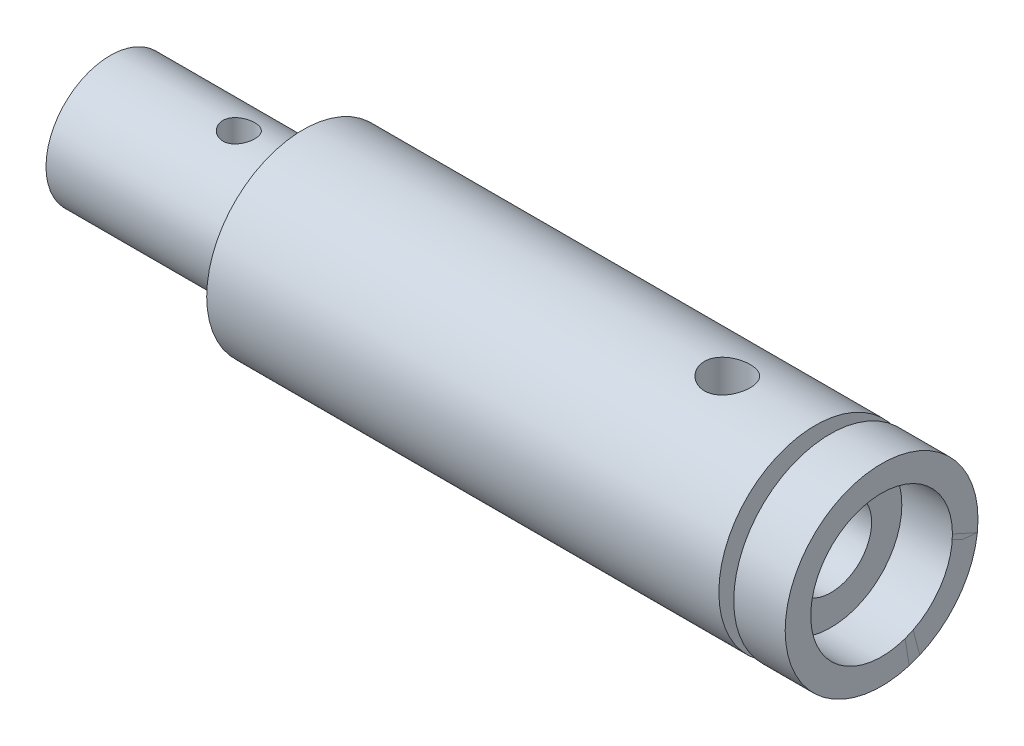
ISO-10303-21;
HEADER;
FILE_DESCRIPTION(('STEP AP214'),'2;1');
FILE_NAME('part.step','',(''),(''),'','','');
FILE_SCHEMA(('AUTOMOTIVE_DESIGN { 1 0 10303 214 1 1 1 1 }'));
ENDSEC;
DATA;
#1=APPLICATION_CONTEXT('core data for automotive mechanical design processes');
#2=APPLICATION_PROTOCOL_DEFINITION('international standard','automotive_design',2000,#1);
#3=PRODUCT_CONTEXT('',#1,'mechanical');
#4=PRODUCT('Part','Part','',(#3));
#5=PRODUCT_RELATED_PRODUCT_CATEGORY('part','',(#4));
#6=PRODUCT_DEFINITION_FORMATION('','',#4);
#7=PRODUCT_DEFINITION_CONTEXT('part definition',#1,'design');
#8=PRODUCT_DEFINITION('design','',#6,#7);
#9=PRODUCT_DEFINITION_SHAPE('','',#8);
#10=(LENGTH_UNIT() NAMED_UNIT(*) SI_UNIT(.MILLI.,.METRE.));
#11=(NAMED_UNIT(*) PLANE_ANGLE_UNIT() SI_UNIT($,.RADIAN.));
#12=(NAMED_UNIT(*) SI_UNIT($,.STERADIAN.) SOLID_ANGLE_UNIT());
#13=UNCERTAINTY_MEASURE_WITH_UNIT(LENGTH_MEASURE(1.E-05),#10,'distance_accuracy_value','');
#14=(GEOMETRIC_REPRESENTATION_CONTEXT(3) GLOBAL_UNCERTAINTY_ASSIGNED_CONTEXT((#13)) GLOBAL_UNIT_ASSIGNED_CONTEXT((#10,
#11,#12)) REPRESENTATION_CONTEXT('',''));
#15=CARTESIAN_POINT('',(0.,0.,0.));
#16=DIRECTION('',(0.,0.,1.));
#17=DIRECTION('',(1.,0.,0.));
#18=AXIS2_PLACEMENT_3D('',#15,#16,#17);
#19=CARTESIAN_POINT('',(38.1,0.,0.));
#20=DIRECTION('',(1.,0.,0.));
#21=DIRECTION('',(0.,0.,-1.));
#22=AXIS2_PLACEMENT_3D('',#19,#20,#21);
#23=PLANE('',#22);
#24=CARTESIAN_POINT('',(38.1,0.,0.));
#25=DIRECTION('',(1.,0.,0.));
#26=DIRECTION('',(0.,0.,-1.));
#27=AXIS2_PLACEMENT_3D('',#24,#25,#26);
#28=CIRCLE('',#27,3.5000057);
#29=CARTESIAN_POINT('',(38.1,0.,-3.5000057));
#30=VERTEX_POINT('',#29);
#31=EDGE_CURVE('E51',#30,#30,#28,.T.);
#32=ORIENTED_EDGE('',*,*,#31,.F.);
#33=EDGE_LOOP('',(#32));
#34=FACE_BOUND('',#33,.T.);
#35=CARTESIAN_POINT('',(38.1,0.,0.));
#36=DIRECTION('',(1.,0.,0.));
#37=DIRECTION('',(0.,0.,-1.));
#38=AXIS2_PLACEMENT_3D('',#35,#36,#37);
#39=CIRCLE('',#38,4.7625);
#40=CARTESIAN_POINT('',(38.1,0.,-4.7625));
#41=VERTEX_POINT('',#40);
#42=EDGE_CURVE('E11',#41,#41,#39,.T.);
#43=ORIENTED_EDGE('',*,*,#42,.T.);
#44=EDGE_LOOP('',(#43));
#45=FACE_BOUND('',#44,.T.);
#46=ADVANCED_FACE('F47',(#34,#45),#23,.T.);
#47=OPEN_SHELL('',(#46));
#48=SHELL_BASED_SURFACE_MODEL('B2',(#47));
#49=CARTESIAN_POINT('',(38.1,0.,0.));
#50=DIRECTION('',(-1.,0.,0.));
#51=DIRECTION('',(0.,0.,1.));
#52=AXIS2_PLACEMENT_3D('',#49,#50,#51);
#53=CYLINDRICAL_SURFACE('',#52,4.7625);
#54=CARTESIAN_POINT('',(30.48,4.62642714845916,-1.13030000000001));
#55=CARTESIAN_POINT('',(30.4174775259716,4.62642838901824,-1.13029805423628));
#56=CARTESIAN_POINT('',(30.3549327757224,4.62770838699482,-1.12509469807993));
#57=CARTESIAN_POINT('',(30.231632022083,4.6326785638604,-1.10444752292998));
#58=CARTESIAN_POINT('',(30.1708771909426,4.63637028710392,-1.08899714213106));
#59=CARTESIAN_POINT('',(30.0529575827576,4.64572278948456,-1.04837814678198));
#60=CARTESIAN_POINT('',(29.9957885619544,4.65138118712487,-1.02322128202527));
#61=CARTESIAN_POINT('',(29.8864782330937,4.66402656033618,-0.963938374115178));
#62=CARTESIAN_POINT('',(29.8343370072882,4.67101355763678,-0.929812184262627));
#63=CARTESIAN_POINT('',(29.7355270444801,4.68568402813969,-0.852836301919562));
#64=CARTESIAN_POINT('',(29.6889727707916,4.69337771733691,-0.809841598425515));
#65=CARTESIAN_POINT('',(29.6036641255741,4.70850573012954,-0.716661805014789));
#66=CARTESIAN_POINT('',(29.5649104296223,4.71594003121431,-0.666476092957034));
#67=CARTESIAN_POINT('',(29.4958411997972,4.72982392662853,-0.559561665599796));
#68=CARTESIAN_POINT('',(29.4656371319024,4.7362600587655,-0.50275904156));
#69=CARTESIAN_POINT('',(29.4152477682259,4.74730637166582,-0.384705189759934));
#70=CARTESIAN_POINT('',(29.3950611441609,4.75191679449644,-0.323454553028317));
#71=CARTESIAN_POINT('',(29.3656435558391,4.75872001042334,-0.199435431201457));
#72=CARTESIAN_POINT('',(29.3562184738088,4.76095558789368,-0.136715378385376));
#73=CARTESIAN_POINT('',(29.3479831971712,4.76290595779978,-0.0105471731538505));
#74=CARTESIAN_POINT('',(29.3491715822857,4.7626210875181,0.0529008807067508));
#75=CARTESIAN_POINT('',(29.3619878043426,4.75959486535025,0.177381143927697));
#76=CARTESIAN_POINT('',(29.3734062398402,4.75690278929689,0.23843628935024));
#77=CARTESIAN_POINT('',(29.4060230697014,4.74942148334886,0.357738034135681));
#78=CARTESIAN_POINT('',(29.427221954153,4.74463214836336,0.41598449259665));
#79=CARTESIAN_POINT('',(29.4789739129789,4.73341744305927,0.528579543133836));
#80=CARTESIAN_POINT('',(29.5096035332136,4.72697876022153,0.582891572165093));
#81=CARTESIAN_POINT('',(29.5792898743976,4.7131670289965,0.685679466576262));
#82=CARTESIAN_POINT('',(29.6183479300973,4.70579383269348,0.734154405681971));
#83=CARTESIAN_POINT('',(29.7049124952201,4.69070701664461,0.825139727879797));
#84=CARTESIAN_POINT('',(29.7526021517143,4.68298948105039,0.867475386599062));
#85=CARTESIAN_POINT('',(29.854484880592,4.66825033727962,0.943584762001427));
#86=CARTESIAN_POINT('',(29.9086781985238,4.66122875539735,0.97735815526305));
#87=CARTESIAN_POINT('',(30.0223470965797,4.64866391717303,1.03548149898306));
#88=CARTESIAN_POINT('',(30.0818429361595,4.64312668568723,1.05979322029419));
#89=CARTESIAN_POINT('',(30.2042394839337,4.6342370321862,1.09801758146265));
#90=CARTESIAN_POINT('',(30.2671395417684,4.63088419443757,1.11193220016863));
#91=CARTESIAN_POINT('',(30.3929486305075,4.62682920681551,1.12868548039285));
#92=CARTESIAN_POINT('',(30.4558215409437,4.62606563978159,1.13178082925176));
#93=CARTESIAN_POINT('',(30.5811852257098,4.62710909642491,1.12750718204535));
#94=CARTESIAN_POINT('',(30.6436760309748,4.6289159091626,1.12013904467148));
#95=CARTESIAN_POINT('',(30.7655736827724,4.63483804338209,1.09537169422542));
#96=CARTESIAN_POINT('',(30.8250119865441,4.63891973604529,1.07811850697576));
#97=CARTESIAN_POINT('',(30.9401535080337,4.64890046664806,1.03423110579621));
#98=CARTESIAN_POINT('',(30.9958563170258,4.6547997030637,1.0075958672993));
#99=CARTESIAN_POINT('',(31.1030430296264,4.66788249324333,0.945151389946631));
#100=CARTESIAN_POINT('',(31.1544337592089,4.67508711291606,0.909186724966106));
#101=CARTESIAN_POINT('',(31.2505449640821,4.68991561801779,0.829303668896753));
#102=CARTESIAN_POINT('',(31.2952644544695,4.69753956512693,0.785384105507542));
#103=CARTESIAN_POINT('',(31.3777852160885,4.71255346581324,0.689666770395243));
#104=CARTESIAN_POINT('',(31.4154099797708,4.7199344104917,0.637715160229861));
#105=CARTESIAN_POINT('',(31.481399685825,4.73345357065448,0.528080996625007));
#106=CARTESIAN_POINT('',(31.5097650949585,4.73959184877535,0.470398732257507));
#107=CARTESIAN_POINT('',(31.5561977943514,4.74989666973638,0.351326818689582));
#108=CARTESIAN_POINT('',(31.5743360521981,4.75407676549875,0.289966071089918));
#109=CARTESIAN_POINT('',(31.6000166732252,4.76005328584338,0.164956304659746));
#110=CARTESIAN_POINT('',(31.6075608670675,4.76185012225163,0.101307683125541));
#111=CARTESIAN_POINT('',(31.6117448257628,4.76284277619185,-0.0248058123466602));
#112=CARTESIAN_POINT('',(31.6086463021068,4.76210102100744,-0.0872616512535999));
#113=CARTESIAN_POINT('',(31.5922263168143,4.75823630150041,-0.210735438966013));
#114=CARTESIAN_POINT('',(31.5789051060361,4.75511339560976,-0.271753423017674));
#115=CARTESIAN_POINT('',(31.5425522659879,4.74684485428859,-0.390375307573608));
#116=CARTESIAN_POINT('',(31.5195637211855,4.74170820034098,-0.447993078219313));
#117=CARTESIAN_POINT('',(31.4645687352297,4.72995611183917,-0.558585363410872));
#118=CARTESIAN_POINT('',(31.4325612606168,4.72334050783327,-0.611559344922472));
#119=CARTESIAN_POINT('',(31.3596156117081,4.70916627810365,-0.712616660322828));
#120=CARTESIAN_POINT('',(31.3184970787535,4.70159016205745,-0.760567360093442));
#121=CARTESIAN_POINT('',(31.2288524871105,4.68643366014744,-0.848977207813524));
#122=CARTESIAN_POINT('',(31.180324596891,4.67885327369088,-0.889434497967525));
#123=CARTESIAN_POINT('',(31.0762828135499,4.66440648065221,-0.962354542237788));
#124=CARTESIAN_POINT('',(31.0206675833458,4.65755378982526,-0.994675617729678));
#125=CARTESIAN_POINT('',(30.904640168282,4.64551729998629,-1.04946070676234));
#126=CARTESIAN_POINT('',(30.8442317610909,4.64033220265826,-1.07193239358026));
#127=CARTESIAN_POINT('',(30.7332121579242,4.63309160945185,-1.10275167928249));
#128=CARTESIAN_POINT('',(30.6831641625617,4.63061028274686,-1.11306095578954));
#129=CARTESIAN_POINT('',(30.5820823499598,4.62727760135537,-1.1268356772371));
#130=CARTESIAN_POINT('',(30.5310486001582,4.62642613556252,-1.13030158868497));
#131=CARTESIAN_POINT('',(30.48,4.62642714845916,-1.13030000000001));
#132=B_SPLINE_CURVE_WITH_KNOTS('',3,(#54,#55,#56,#57,#58,#59,#60,#61,#62,#63,#64,#65,#66,#67,
#68,#69,#70,#71,#72,#73,#74,#75,#76,#77,#78,#79,#80,#81,#82,#83,#84,#85,#86,#87,#88,#89,#90,#91,
#92,#93,#94,#95,#96,#97,#98,#99,#100,#101,#102,#103,#104,#105,#106,#107,#108,#109,#110,#111,
#112,#113,#114,#115,#116,#117,#118,#119,#120,#121,#122,#123,#124,#125,#126,#127,#128,#129,#130,
#131),.UNSPECIFIED.,.T.,.F.,(4,2,2,2,2,2,2,2,2,2,2,2,2,2,2,2,2,2,2,2,2,2,2,2,2,2,2,2,2,2,2,2,2,
2,2,2,2,2,4),(0.,0.187380121042666,0.374880349201827,0.562154315010251,0.749431343997337,
0.940055506735493,1.13069617158295,1.32371850082296,1.51671522902966,1.70617275891674,
1.89560493626408,2.08124599438501,2.26689635579563,2.45409517358993,2.64132365848949,
2.83312791507996,3.02493941559167,3.21751806320305,3.41006004856846,3.59800175755486,
3.78592804389816,3.97114726568218,4.15638672060753,4.34493623230586,4.53351355287895,
4.72629599338792,4.91906871428539,5.11048675596528,5.30187171639604,5.48858443275627,
5.67529256744964,5.86117727273008,6.04708328680093,6.23706378966135,6.42709133036922,
6.62022893778871,6.81321581056899,6.96621911322522,7.11921198539395),.UNSPECIFIED.);
#133=CARTESIAN_POINT('',(30.48,4.62642714845916,-1.13030000000001));
#134=VERTEX_POINT('',#133);
#135=EDGE_CURVE('E86',#134,#134,#132,.T.);
#136=ORIENTED_EDGE('',*,*,#135,.F.);
#137=EDGE_LOOP('',(#136));
#138=FACE_BOUND('',#137,.T.);
#139=CARTESIAN_POINT('',(9.525,0.,0.));
#140=DIRECTION('',(-1.,0.,0.));
#141=DIRECTION('',(0.,0.,1.));
#142=AXIS2_PLACEMENT_3D('',#139,#140,#141);
#143=CIRCLE('',#142,4.7625);
#144=CARTESIAN_POINT('',(9.525,0.,4.7625));
#145=VERTEX_POINT('',#144);
#146=EDGE_CURVE('E98',#145,#145,#143,.T.);
#147=ORIENTED_EDGE('',*,*,#146,.F.);
#148=EDGE_LOOP('',(#147));
#149=FACE_BOUND('',#148,.T.);
#150=CARTESIAN_POINT('',(34.8234,0.,0.));
#151=DIRECTION('',(1.,0.,0.));
#152=DIRECTION('',(0.,0.,-1.));
#153=AXIS2_PLACEMENT_3D('',#150,#151,#152);
#154=CIRCLE('',#153,4.7625);
#155=CARTESIAN_POINT('',(34.8234,0.,-4.7625));
#156=VERTEX_POINT('',#155);
#157=EDGE_CURVE('E129',#156,#156,#154,.T.);
#158=ORIENTED_EDGE('',*,*,#157,.F.);
#159=EDGE_LOOP('',(#158));
#160=FACE_BOUND('',#159,.T.);
#161=ADVANCED_FACE('F72',(#138,#149,#160),#53,.T.);
#162=CARTESIAN_POINT('',(27.686,0.,0.));
#163=DIRECTION('',(1.,0.,0.));
#164=DIRECTION('',(0.,0.,-1.));
#165=AXIS2_PLACEMENT_3D('',#162,#163,#164);
#166=CYLINDRICAL_SURFACE('',#165,2.0066);
#167=CARTESIAN_POINT('',(30.48,1.65797028622348,-1.13030000000001));
#168=CARTESIAN_POINT('',(30.537651209096,1.65797637198511,-1.13029575818968));
#169=CARTESIAN_POINT('',(30.5953460500531,1.6610253484613,-1.12585828294536));
#170=CARTESIAN_POINT('',(30.7088640189629,1.67273264944485,-1.10838248876552));
#171=CARTESIAN_POINT('',(30.7646840246714,1.68139988609383,-1.09533050419437));
#172=CARTESIAN_POINT('',(30.872577119279,1.70299732881238,-1.06143323018494));
#173=CARTESIAN_POINT('',(30.9246720396219,1.7158996982644,-1.04063871395274));
#174=CARTESIAN_POINT('',(31.0246106018923,1.74446762861599,-0.992002970624401));
#175=CARTESIAN_POINT('',(31.0724532218785,1.76013385105756,-0.964160055763447));
#176=CARTESIAN_POINT('',(31.1681287413124,1.79448726439517,-0.898756055590563));
#177=CARTESIAN_POINT('',(31.215418621699,1.81331851857658,-0.860476031372304));
#178=CARTESIAN_POINT('',(31.303346743248,1.85072451409441,-0.776766436810115));
#179=CARTESIAN_POINT('',(31.343980781707,1.86929908662915,-0.731332384427765));
#180=CARTESIAN_POINT('',(31.421103338456,1.90611899100281,-0.629554883377021));
#181=CARTESIAN_POINT('',(31.4568739746953,1.92417921142352,-0.572593976802603));
#182=CARTESIAN_POINT('',(31.518070785692,1.95595793429568,-0.452252347783174));
#183=CARTESIAN_POINT('',(31.5435052285507,1.96967990502991,-0.388876807408988));
#184=CARTESIAN_POINT('',(31.5809841456561,1.99017791322298,-0.263298922756156));
#185=CARTESIAN_POINT('',(31.5939958143849,1.99745173094696,-0.201468493186618));
#186=CARTESIAN_POINT('',(31.6094970835921,2.00613694274782,-0.0761139088710515));
#187=CARTESIAN_POINT('',(31.6119951448153,2.0075530507558,-0.0125911574556182));
#188=CARTESIAN_POINT('',(31.606649179399,2.0045455488276,0.106850205033367));
#189=CARTESIAN_POINT('',(31.5999095057508,2.00074545106449,0.162838624304155));
#190=CARTESIAN_POINT('',(31.5783304080036,1.98874702230872,0.272734613055335));
#191=CARTESIAN_POINT('',(31.5634903561887,1.98054835046188,0.326642020926975));
#192=CARTESIAN_POINT('',(31.526164753,1.96037701770621,0.431567589448574));
#193=CARTESIAN_POINT('',(31.5036068992025,1.94836874781511,0.482552899430885));
#194=CARTESIAN_POINT('',(31.4516549550227,1.92158367402541,0.580105321753616));
#195=CARTESIAN_POINT('',(31.4222587746444,1.90680602399083,0.626671077208097));
#196=CARTESIAN_POINT('',(31.3537534431108,1.87384893860437,0.719601195939151));
#197=CARTESIAN_POINT('',(31.3139279027535,1.85547396405177,0.765368010966163));
#198=CARTESIAN_POINT('',(31.2275637262767,1.81829489840693,0.849932765249489));
#199=CARTESIAN_POINT('',(31.1810177300013,1.79949035611598,0.888722957819223));
#200=CARTESIAN_POINT('',(31.0772351650225,1.7615352362719,0.961921435377075));
#201=CARTESIAN_POINT('',(31.0194032870042,1.74252111781036,0.995564736747802));
#202=CARTESIAN_POINT('',(30.897679012948,1.7087784001161,1.05243571686153));
#203=CARTESIAN_POINT('',(30.8337937367897,1.69404484714624,1.0756754522478));
#204=CARTESIAN_POINT('',(30.7069675029055,1.67236518692916,1.10905776708862));
#205=CARTESIAN_POINT('',(30.6443578934537,1.66489153536031,1.12009738714326));
#206=CARTESIAN_POINT('',(30.5177645838291,1.6572034845318,1.13144850319234));
#207=CARTESIAN_POINT('',(30.4537827906175,1.65697959102846,1.13177403031369));
#208=CARTESIAN_POINT('',(30.3370236269408,1.66326124789684,1.12250636240806));
#209=CARTESIAN_POINT('',(30.2840555800528,1.66872233766816,1.11445273704983));
#210=CARTESIAN_POINT('',(30.1803846921949,1.6840438818777,1.09116121762533));
#211=CARTESIAN_POINT('',(30.1296829611183,1.69390646646436,1.07591984477233));
#212=CARTESIAN_POINT('',(30.0296040249903,1.7173395027059,1.03812264126763));
#213=CARTESIAN_POINT('',(29.980359939537,1.73104195374579,1.01529973584392));
#214=CARTESIAN_POINT('',(29.8861052812119,1.76055942539692,0.963208300403961));
#215=CARTESIAN_POINT('',(29.8410967431823,1.77637545267181,0.933936694636107));
#216=CARTESIAN_POINT('',(29.74867152822,1.81151423791696,0.864078193507193));
#217=CARTESIAN_POINT('',(29.7021175367299,1.8309801706988,0.822416850455627));
#218=CARTESIAN_POINT('',(29.616296521323,1.86905581433525,0.73177360033681));
#219=CARTESIAN_POINT('',(29.5770343288531,1.88766495139167,0.682786878095551));
#220=CARTESIAN_POINT('',(29.5047500564127,1.92326046309013,0.575239963565444));
#221=CARTESIAN_POINT('',(29.4722273531428,1.94008823325962,0.516287380473036));
#222=CARTESIAN_POINT('',(29.4179065509982,1.9688512061512,0.392539738067628));
#223=CARTESIAN_POINT('',(29.3960969104735,1.9807916718561,0.327751055716763));
#224=CARTESIAN_POINT('',(29.3660957967992,1.99737580942607,0.2014045788131));
#225=CARTESIAN_POINT('',(29.3567251982543,2.0026485261898,0.140210094316745));
#226=CARTESIAN_POINT('',(29.3481409612112,2.00747497830063,0.0169004675144974));
#227=CARTESIAN_POINT('',(29.3489213636172,2.00703206897949,-0.0452141132610418));
#228=CARTESIAN_POINT('',(29.3600092222191,2.00080706438243,-0.162229491830126));
#229=CARTESIAN_POINT('',(29.3693931836723,1.99554256873961,-0.21724953244676));
#230=CARTESIAN_POINT('',(29.3959528496194,1.98088395688254,-0.324789512871055));
#231=CARTESIAN_POINT('',(29.4131294418231,1.97148937018629,-0.377309167089935));
#232=CARTESIAN_POINT('',(29.4552411583277,1.94901763234977,-0.480246548826346));
#233=CARTESIAN_POINT('',(29.4803994403406,1.93583574364216,-0.530549324639038));
#234=CARTESIAN_POINT('',(29.5374746214801,1.90699069543875,-0.626368651197417));
#235=CARTESIAN_POINT('',(29.5693940805527,1.89132659668533,-0.6718833792752));
#236=CARTESIAN_POINT('',(29.6433996521795,1.85676328904104,-0.762559187975446));
#237=CARTESIAN_POINT('',(29.6862417254275,1.83770057584232,-0.807041650274424));
#238=CARTESIAN_POINT('',(29.7786666220146,1.7997107194572,-0.888544773205661));
#239=CARTESIAN_POINT('',(29.828258101351,1.78078378376282,-0.925555697837142));
#240=CARTESIAN_POINT('',(29.9374385239224,1.74367470592001,-0.993812600678889));
#241=CARTESIAN_POINT('',(29.9975027141693,1.72566131401167,-1.02439779980572));
#242=CARTESIAN_POINT('',(30.1232025036503,1.694847031231,-1.07462502182382));
#243=CARTESIAN_POINT('',(30.1888201781428,1.68203008936981,-1.09430081239785));
#244=CARTESIAN_POINT('',(30.2927399786615,1.66811353993527,-1.11530910819667));
#245=CARTESIAN_POINT('',(30.3298624722939,1.66433594009497,-1.12091473749272));
#246=CARTESIAN_POINT('',(30.4046504686519,1.65926245642188,-1.12841137188856));
#247=CARTESIAN_POINT('',(30.442315913103,1.65796630822591,-1.13030277268685));
#248=CARTESIAN_POINT('',(30.48,1.65797028622348,-1.13030000000001));
#249=B_SPLINE_CURVE_WITH_KNOTS('',3,(#167,#168,#169,#170,#171,#172,#173,#174,#175,#176,#177,
#178,#179,#180,#181,#182,#183,#184,#185,#186,#187,#188,#189,#190,#191,#192,#193,#194,#195,#196,
#197,#198,#199,#200,#201,#202,#203,#204,#205,#206,#207,#208,#209,#210,#211,#212,#213,#214,#215,
#216,#217,#218,#219,#220,#221,#222,#223,#224,#225,#226,#227,#228,#229,#230,#231,#232,#233,#234,
#235,#236,#237,#238,#239,#240,#241,#242,#243,#244,#245,#246,#247,#248),.UNSPECIFIED.,.T.,.F.,(4,
2,2,2,2,2,2,2,2,2,2,2,2,2,2,2,2,2,2,2,2,2,2,2,2,2,2,2,2,2,2,2,2,2,2,2,2,2,2,2,4),(0.,
0.172793012733998,0.345860796795426,0.517813089371491,0.689806595564025,0.880106292646286,
1.07052569142838,1.27834162951455,1.48599100323518,1.6756955857872,1.86524747580937,
2.0340076940939,2.20278099182945,2.37318077999774,2.54363271599299,2.73302836796347,
2.92263303950351,3.13022789629361,3.33758154560349,3.52839104344626,3.7189506480898,
3.87977963433926,4.04068653997023,4.20800023838711,4.37539391165051,4.57086929359128,
4.76647373635164,4.97352040854563,5.18034352840847,5.36568597777937,5.55091962767826,
5.71833820331427,5.88577585548936,6.05838281740349,6.23105524970184,6.42415185315247,
6.61749847514994,6.8256895898222,7.03323264487317,7.14619195368792,7.25913922763368),.UNSPECIFIED.);
#250=CARTESIAN_POINT('',(30.48,1.65797028622348,-1.13030000000001));
#251=VERTEX_POINT('',#250);
#252=EDGE_CURVE('E90',#251,#251,#249,.T.);
#253=ORIENTED_EDGE('',*,*,#252,.F.);
#254=EDGE_LOOP('',(#253));
#255=FACE_BOUND('',#254,.T.);
#256=CARTESIAN_POINT('',(27.686,0.,0.));
#257=DIRECTION('',(1.,0.,0.));
#258=DIRECTION('',(0.,0.,-1.));
#259=AXIS2_PLACEMENT_3D('',#256,#257,#258);
#260=CIRCLE('',#259,2.0066);
#261=CARTESIAN_POINT('',(27.686,0.,-2.0066));
#262=VERTEX_POINT('',#261);
#263=EDGE_CURVE('E81',#262,#262,#260,.T.);
#264=ORIENTED_EDGE('',*,*,#263,.F.);
#265=EDGE_LOOP('',(#264));
#266=FACE_BOUND('',#265,.T.);
#267=CARTESIAN_POINT('',(35.59999992,0.,0.));
#268=DIRECTION('',(1.,0.,0.));
#269=DIRECTION('',(0.,0.,-1.));
#270=AXIS2_PLACEMENT_3D('',#267,#268,#269);
#271=CIRCLE('',#270,2.0066);
#272=CARTESIAN_POINT('',(35.59999992,0.,-2.0066));
#273=VERTEX_POINT('',#272);
#274=EDGE_CURVE('E77',#273,#273,#271,.F.);
#275=ORIENTED_EDGE('',*,*,#274,.F.);
#276=EDGE_LOOP('',(#275));
#277=FACE_BOUND('',#276,.T.);
#278=ADVANCED_FACE('F100',(#255,#266,#277),#166,.F.);
#279=CARTESIAN_POINT('',(35.56,0.,0.));
#280=DIRECTION('',(1.,0.,0.));
#281=DIRECTION('',(0.,0.,-1.));
#282=AXIS2_PLACEMENT_3D('',#279,#280,#281);
#283=CIRCLE('',#282,4.7625);
#284=CARTESIAN_POINT('',(35.56,0.,4.7625));
#285=VERTEX_POINT('',#284);
#286=EDGE_CURVE('E132',#285,#285,#283,.T.);
#287=CARTESIAN_POINT('',(38.1,0.,0.));
#288=DIRECTION('',(1.,0.,0.));
#289=DIRECTION('',(0.,0.,-1.));
#290=AXIS2_PLACEMENT_3D('',#287,#288,#289);
#291=CIRCLE('',#290,4.7625);
#292=CARTESIAN_POINT('',(38.1,0.,4.7625));
#293=VERTEX_POINT('',#292);
#294=EDGE_CURVE('E46',#293,#293,#291,.T.);
#295=CARTESIAN_POINT('',(35.56,0.,4.7625));
#296=CARTESIAN_POINT('',(35.5864583333333,0.,4.7625));
#297=CARTESIAN_POINT('',(35.6129166666667,0.,4.7625));
#298=CARTESIAN_POINT('',(35.6658333333333,0.,4.7625));
#299=CARTESIAN_POINT('',(35.6922916666667,0.,4.7625));
#300=CARTESIAN_POINT('',(35.7452083333333,0.,4.7625));
#301=CARTESIAN_POINT('',(35.7716666666667,0.,4.7625));
#302=CARTESIAN_POINT('',(35.8245833333333,0.,4.7625));
#303=CARTESIAN_POINT('',(35.8510416666667,0.,4.7625));
#304=CARTESIAN_POINT('',(35.9039583333333,0.,4.7625));
#305=CARTESIAN_POINT('',(35.9304166666667,0.,4.7625));
#306=CARTESIAN_POINT('',(35.9833333333333,0.,4.7625));
#307=CARTESIAN_POINT('',(36.0097916666667,0.,4.7625));
#308=CARTESIAN_POINT('',(36.0627083333333,0.,4.7625));
#309=CARTESIAN_POINT('',(36.0891666666667,0.,4.7625));
#310=CARTESIAN_POINT('',(36.1420833333333,0.,4.7625));
#311=CARTESIAN_POINT('',(36.1685416666667,0.,4.7625));
#312=CARTESIAN_POINT('',(36.2214583333333,0.,4.7625));
#313=CARTESIAN_POINT('',(36.2479166666667,0.,4.7625));
#314=CARTESIAN_POINT('',(36.3008333333333,0.,4.7625));
#315=CARTESIAN_POINT('',(36.3272916666667,0.,4.7625));
#316=CARTESIAN_POINT('',(36.3802083333333,0.,4.7625));
#317=CARTESIAN_POINT('',(36.4066666666667,0.,4.7625));
#318=CARTESIAN_POINT('',(36.4595833333333,0.,4.7625));
#319=CARTESIAN_POINT('',(36.4860416666667,0.,4.7625));
#320=CARTESIAN_POINT('',(36.5389583333333,0.,4.7625));
#321=CARTESIAN_POINT('',(36.5654166666667,0.,4.7625));
#322=CARTESIAN_POINT('',(36.6183333333333,0.,4.7625));
#323=CARTESIAN_POINT('',(36.6447916666667,0.,4.7625));
#324=CARTESIAN_POINT('',(36.6977083333333,0.,4.7625));
#325=CARTESIAN_POINT('',(36.7241666666667,0.,4.7625));
#326=CARTESIAN_POINT('',(36.7770833333333,0.,4.7625));
#327=CARTESIAN_POINT('',(36.8035416666667,0.,4.7625));
#328=CARTESIAN_POINT('',(36.8564583333333,0.,4.7625));
#329=CARTESIAN_POINT('',(36.8829166666667,0.,4.7625));
#330=CARTESIAN_POINT('',(36.9358333333333,0.,4.7625));
#331=CARTESIAN_POINT('',(36.9622916666667,0.,4.7625));
#332=CARTESIAN_POINT('',(37.0152083333333,0.,4.7625));
#333=CARTESIAN_POINT('',(37.0416666666667,0.,4.7625));
#334=CARTESIAN_POINT('',(37.0945833333333,0.,4.7625));
#335=CARTESIAN_POINT('',(37.1210416666667,0.,4.7625));
#336=CARTESIAN_POINT('',(37.1739583333333,0.,4.7625));
#337=CARTESIAN_POINT('',(37.2004166666667,0.,4.7625));
#338=CARTESIAN_POINT('',(37.2533333333333,0.,4.7625));
#339=CARTESIAN_POINT('',(37.2797916666667,0.,4.7625));
#340=CARTESIAN_POINT('',(37.3327083333333,0.,4.7625));
#341=CARTESIAN_POINT('',(37.3591666666667,0.,4.7625));
#342=CARTESIAN_POINT('',(37.4120833333333,0.,4.7625));
#343=CARTESIAN_POINT('',(37.4385416666667,0.,4.7625));
#344=CARTESIAN_POINT('',(37.4914583333333,0.,4.7625));
#345=CARTESIAN_POINT('',(37.5179166666667,0.,4.7625));
#346=CARTESIAN_POINT('',(37.5708333333333,0.,4.7625));
#347=CARTESIAN_POINT('',(37.5972916666667,0.,4.7625));
#348=CARTESIAN_POINT('',(37.6502083333333,0.,4.7625));
#349=CARTESIAN_POINT('',(37.6766666666667,0.,4.7625));
#350=CARTESIAN_POINT('',(37.7295833333333,0.,4.7625));
#351=CARTESIAN_POINT('',(37.7560416666667,0.,4.7625));
#352=CARTESIAN_POINT('',(37.8089583333333,0.,4.7625));
#353=CARTESIAN_POINT('',(37.8354166666667,0.,4.7625));
#354=CARTESIAN_POINT('',(37.8883333333333,0.,4.7625));
#355=CARTESIAN_POINT('',(37.9147916666667,0.,4.7625));
#356=CARTESIAN_POINT('',(37.9677083333333,0.,4.7625));
#357=CARTESIAN_POINT('',(37.9941666666667,0.,4.7625));
#358=CARTESIAN_POINT('',(38.0470833333333,0.,4.7625));
#359=CARTESIAN_POINT('',(38.0735416666667,0.,4.7625));
#360=CARTESIAN_POINT('',(38.1,0.,4.7625));
#361=B_SPLINE_CURVE_WITH_KNOTS('',3,(#295,#296,#297,#298,#299,#300,#301,#302,#303,#304,#305,
#306,#307,#308,#309,#310,#311,#312,#313,#314,#315,#316,#317,#318,#319,#320,#321,#322,#323,#324,
#325,#326,#327,#328,#329,#330,#331,#332,#333,#334,#335,#336,#337,#338,#339,#340,#341,#342,#343,
#344,#345,#346,#347,#348,#349,#350,#351,#352,#353,#354,#355,#356,#357,#358,#359,#360),
.UNSPECIFIED.,.F.,.F.,(4,2,2,2,2,2,2,2,2,2,2,2,2,2,2,2,2,2,2,2,2,2,2,2,2,2,2,2,2,2,2,2,4),(0.,
0.0793749999999996,0.158749999999999,0.238124999999999,0.317499999999998,0.396874999999998,
0.476249999999998,0.555624999999997,0.634999999999997,0.714374999999996,0.793749999999996,
0.873124999999995,0.952499999999995,1.03187499999999,1.11124999999999,1.19062499999999,1.27,
1.349375,1.42875,1.508125,1.5875,1.666875,1.74625,1.825625,1.905,1.984375,2.06375,2.143125,
2.2225,2.301875,2.38124999999999,2.46062499999999,2.54),.UNSPECIFIED.);
#362=EDGE_CURVE('BSEAM74',#285,#293,#361,.T.);
#363=ORIENTED_EDGE('',*,*,#286,.T.);
#364=ORIENTED_EDGE('',*,*,#294,.F.);
#365=ORIENTED_EDGE('',*,*,#362,.T.);
#366=ORIENTED_EDGE('',*,*,#362,.F.);
#367=EDGE_LOOP('',(#363,#365,#364,#366));
#368=FACE_BOUND('',#367,.T.);
#369=ADVANCED_FACE('F74',(#368),#53,.T.);
#370=CARTESIAN_POINT('',(38.1,0.,0.));
#371=DIRECTION('',(1.,0.,0.));
#372=DIRECTION('',(0.,0.,-1.));
#373=AXIS2_PLACEMENT_3D('',#370,#371,#372);
#374=PLANE('',#373);
#375=CARTESIAN_POINT('',(38.1,0.,0.));
#376=DIRECTION('',(1.,0.,0.));
#377=DIRECTION('',(0.,0.,-1.));
#378=AXIS2_PLACEMENT_3D('',#375,#376,#377);
#379=CIRCLE('',#378,3.5000057);
#380=CARTESIAN_POINT('',(38.1,0.,-3.5000057));
#381=VERTEX_POINT('',#380);
#382=EDGE_CURVE('E125',#381,#381,#379,.T.);
#383=ORIENTED_EDGE('',*,*,#382,.F.);
#384=EDGE_LOOP('',(#383));
#385=FACE_BOUND('',#384,.T.);
#386=ORIENTED_EDGE('',*,*,#294,.T.);
#387=EDGE_LOOP('',(#386));
#388=FACE_BOUND('',#387,.T.);
#389=ADVANCED_FACE('F164',(#385,#388),#374,.T.);
#390=CARTESIAN_POINT('',(27.686,0.,0.));
#391=DIRECTION('',(1.,0.,0.));
#392=DIRECTION('',(0.,0.,-1.));
#393=AXIS2_PLACEMENT_3D('',#390,#391,#392);
#394=PLANE('',#393);
#395=ORIENTED_EDGE('',*,*,#263,.T.);
#396=EDGE_LOOP('',(#395));
#397=FACE_BOUND('',#396,.T.);
#398=ADVANCED_FACE('F109',(#397),#394,.T.);
#399=CARTESIAN_POINT('',(30.48,8.6868,0.));
#400=DIRECTION('',(0.,-1.,0.));
#401=DIRECTION('',(0.,0.,-1.));
#402=AXIS2_PLACEMENT_3D('',#399,#400,#401);
#403=CYLINDRICAL_SURFACE('',#402,1.13030000000001);
#404=ORIENTED_EDGE('',*,*,#252,.T.);
#405=EDGE_LOOP('',(#404));
#406=FACE_BOUND('',#405,.T.);
#407=ORIENTED_EDGE('',*,*,#135,.T.);
#408=EDGE_LOOP('',(#407));
#409=FACE_BOUND('',#408,.T.);
#410=ADVANCED_FACE('F104',(#406,#409),#403,.F.);
#411=CARTESIAN_POINT('',(9.525,0.,0.));
#412=DIRECTION('',(-1.,0.,0.));
#413=DIRECTION('',(0.,0.,1.));
#414=AXIS2_PLACEMENT_3D('',#411,#412,#413);
#415=PLANE('',#414);
#416=CARTESIAN_POINT('',(9.525,0.,0.));
#417=DIRECTION('',(-1.,0.,0.));
#418=DIRECTION('',(0.,0.,1.));
#419=AXIS2_PLACEMENT_3D('',#416,#417,#418);
#420=CIRCLE('',#419,3.175);
#421=CARTESIAN_POINT('',(9.525,0.,3.175));
#422=VERTEX_POINT('',#421);
#423=EDGE_CURVE('E121',#422,#422,#420,.T.);
#424=ORIENTED_EDGE('',*,*,#423,.F.);
#425=EDGE_LOOP('',(#424));
#426=FACE_BOUND('',#425,.T.);
#427=ORIENTED_EDGE('',*,*,#146,.T.);
#428=EDGE_LOOP('',(#427));
#429=FACE_BOUND('',#428,.T.);
#430=ADVANCED_FACE('F108',(#426,#429),#415,.T.);
#431=CARTESIAN_POINT('',(9.525,0.,0.));
#432=DIRECTION('',(-1.,0.,0.));
#433=DIRECTION('',(0.,0.,1.));
#434=AXIS2_PLACEMENT_3D('',#431,#432,#433);
#435=CYLINDRICAL_SURFACE('',#434,3.175);
#436=CARTESIAN_POINT('',(6.35,-3.07581310225443,0.7874));
#437=CARTESIAN_POINT('',(6.3065075021694,-3.075813939192,0.787398744653916));
#438=CARTESIAN_POINT('',(6.26300103699984,-3.07674566145374,0.783784226445852));
#439=CARTESIAN_POINT('',(6.17723664816889,-3.0803625423924,0.769444212040904));
#440=CARTESIAN_POINT('',(6.13497947835965,-3.08304873806023,0.758714510319309));
#441=CARTESIAN_POINT('',(6.05296662188354,-3.08985205147743,0.730512083187864));
#442=CARTESIAN_POINT('',(6.01320781427514,-3.09396734028734,0.713047973268173));
#443=CARTESIAN_POINT('',(5.93718029137026,-3.10316287879354,0.671898613390606));
#444=CARTESIAN_POINT('',(5.9009117097853,-3.10824316543701,0.648213125219556));
#445=CARTESIAN_POINT('',(5.83210863740529,-3.11891943941669,0.594745480228861));
#446=CARTESIAN_POINT('',(5.79966087582295,-3.12452355873939,0.564853320914091));
#447=CARTESIAN_POINT('',(5.74018427843339,-3.13554546853052,0.500057836854159));
#448=CARTESIAN_POINT('',(5.71315594309829,-3.14096324175205,0.465154049806475));
#449=CARTESIAN_POINT('',(5.66493138615076,-3.15109190098523,0.390732789039579));
#450=CARTESIAN_POINT('',(5.64382024601062,-3.15579207165152,0.351158598507652));
#451=CARTESIAN_POINT('',(5.60858236631455,-3.16386323206305,0.268887241267554));
#452=CARTESIAN_POINT('',(5.5944546131789,-3.1672344146853,0.22619052880039));
#453=CARTESIAN_POINT('',(5.57386200190988,-3.17221027199584,0.139790139759614));
#454=CARTESIAN_POINT('',(5.56724989496921,-3.17384884607327,0.0961235443472484));
#455=CARTESIAN_POINT('',(5.56141418710287,-3.17529294846481,0.00827220844257288));
#456=CARTESIAN_POINT('',(5.56218951053071,-3.17509874364066,-0.0359124556806589));
#457=CARTESIAN_POINT('',(5.57100049547967,-3.17292445001065,-0.122524852571927));
#458=CARTESIAN_POINT('',(5.57887723188311,-3.1709834549647,-0.164969881520884));
#459=CARTESIAN_POINT('',(5.60141214765311,-3.16557912503432,-0.247915901823041));
#460=CARTESIAN_POINT('',(5.61607068475941,-3.16211570984276,-0.288416790498507));
#461=CARTESIAN_POINT('',(5.65188248465348,-3.15399567959344,-0.366745072334393));
#462=CARTESIAN_POINT('',(5.67309255235268,-3.14932868981507,-0.404545374544142));
#463=CARTESIAN_POINT('',(5.72136229878054,-3.13930813357491,-0.476106034644211));
#464=CARTESIAN_POINT('',(5.74842298068023,-3.13395444943371,-0.509865698165378));
#465=CARTESIAN_POINT('',(5.80847867569626,-3.12297597059372,-0.573334431368741));
#466=CARTESIAN_POINT('',(5.84161258434032,-3.11734775299395,-0.602911621812153));
#467=CARTESIAN_POINT('',(5.91242902507928,-3.10658526700961,-0.656118863638047));
#468=CARTESIAN_POINT('',(5.95011176276347,-3.10145102096949,-0.679748646071946));
#469=CARTESIAN_POINT('',(6.02921177009863,-3.09224573629719,-0.720472946534791));
#470=CARTESIAN_POINT('',(6.07064578145341,-3.08817981532904,-0.737536183225514));
#471=CARTESIAN_POINT('',(6.15591937179795,-3.08163748493669,-0.764414044408799));
#472=CARTESIAN_POINT('',(6.19975844322203,-3.07916074152135,-0.774230192058727));
#473=CARTESIAN_POINT('',(6.2873759080488,-3.07614716365072,-0.786117397865361));
#474=CARTESIAN_POINT('',(6.33112622746548,-3.07556155245551,-0.788383246102544));
#475=CARTESIAN_POINT('',(6.41837987623272,-3.07626385331309,-0.78563841377291));
#476=CARTESIAN_POINT('',(6.46188322756007,-3.07755159595384,-0.780628391181266));
#477=CARTESIAN_POINT('',(6.54668781628929,-3.08180881345485,-0.763644712630663));
#478=CARTESIAN_POINT('',(6.58801318363588,-3.08475098063085,-0.751784048072299));
#479=CARTESIAN_POINT('',(6.66808920748939,-3.09195969992218,-0.721560843905088));
#480=CARTESIAN_POINT('',(6.70683956212605,-3.09622640698274,-0.703197543579798));
#481=CARTESIAN_POINT('',(6.78149211019935,-3.10570645375419,-0.660081187835403));
#482=CARTESIAN_POINT('',(6.81732473409086,-3.11093650401891,-0.63521143340858));
#483=CARTESIAN_POINT('',(6.88437965259862,-3.12171274313181,-0.579936031663543));
#484=CARTESIAN_POINT('',(6.9156012007029,-3.12725898296863,-0.549529489740265));
#485=CARTESIAN_POINT('',(6.97333452429436,-3.13820768442019,-0.48315051811217));
#486=CARTESIAN_POINT('',(6.99971167896369,-3.14360326164024,-0.447059655482855));
#487=CARTESIAN_POINT('',(7.04603077035707,-3.15350144612221,-0.370847613185458));
#488=CARTESIAN_POINT('',(7.0659730412783,-3.15800409975364,-0.330726642963904));
#489=CARTESIAN_POINT('',(7.09868451574826,-3.16558085850935,-0.247869409728026));
#490=CARTESIAN_POINT('',(7.11150500137962,-3.16866514841085,-0.205154367753034));
#491=CARTESIAN_POINT('',(7.12976342277996,-3.17310221692133,-0.118089634527151));
#492=CARTESIAN_POINT('',(7.1352027590944,-3.17445532401298,-0.0737402550265616));
#493=CARTESIAN_POINT('',(7.13846675001191,-3.17526440669889,0.014068680224866));
#494=CARTESIAN_POINT('',(7.13649022295012,-3.17476991760286,0.0575205020657558));
#495=CARTESIAN_POINT('',(7.12543325870032,-3.17204896452848,0.143452325637751));
#496=CARTESIAN_POINT('',(7.11635302665849,-3.16982255056599,0.185932355396543));
#497=CARTESIAN_POINT('',(7.0914523243211,-3.16389530862677,0.268510280526712));
#498=CARTESIAN_POINT('',(7.0756672884411,-3.16020223840382,0.308619453963481));
#499=CARTESIAN_POINT('',(7.03783730635837,-3.15173092032296,0.385642600762486));
#500=CARTESIAN_POINT('',(7.01579158215568,-3.14695253761078,0.422556176271458));
#501=CARTESIAN_POINT('',(6.96545682571119,-3.13668511744754,0.493084900281431));
#502=CARTESIAN_POINT('',(6.9370325551554,-3.13118195361417,0.52660147706722));
#503=CARTESIAN_POINT('',(6.87501083497311,-3.12014954155491,0.588456610505146));
#504=CARTESIAN_POINT('',(6.8414120809635,-3.11462028709371,0.616793857602898));
#505=CARTESIAN_POINT('',(6.76925578960345,-3.10404681922997,0.667993949997186));
#506=CARTESIAN_POINT('',(6.73061883096044,-3.09901332040042,0.690747250541119));
#507=CARTESIAN_POINT('',(6.64994904181384,-3.09014474773968,0.729401479098359));
#508=CARTESIAN_POINT('',(6.60791873737093,-3.08630879260421,0.745307449526481));
#509=CARTESIAN_POINT('',(6.52996143803863,-3.08087672885657,0.767414999781062));
#510=CARTESIAN_POINT('',(6.49441121132723,-3.07899203964911,0.774893177484593));
#511=CARTESIAN_POINT('',(6.42257719135974,-3.07645992809139,0.784885996993761));
#512=CARTESIAN_POINT('',(6.386293458763,-3.07581240384986,0.787401047556557));
#513=CARTESIAN_POINT('',(6.35,-3.07581310225443,0.7874));
#514=B_SPLINE_CURVE_WITH_KNOTS('',3,(#436,#437,#438,#439,#440,#441,#442,#443,#444,#445,#446,
#447,#448,#449,#450,#451,#452,#453,#454,#455,#456,#457,#458,#459,#460,#461,#462,#463,#464,#465,
#466,#467,#468,#469,#470,#471,#472,#473,#474,#475,#476,#477,#478,#479,#480,#481,#482,#483,#484,
#485,#486,#487,#488,#489,#490,#491,#492,#493,#494,#495,#496,#497,#498,#499,#500,#501,#502,#503,
#504,#505,#506,#507,#508,#509,#510,#511,#512,#513),.UNSPECIFIED.,.T.,.F.,(4,2,2,2,2,2,2,2,2,2,2,
2,2,2,2,2,2,2,2,2,2,2,2,2,2,2,2,2,2,2,2,2,2,2,2,2,2,2,4),(0.,0.130344231751651,
0.260765573961923,0.391020615621169,0.521280645401966,0.654083865117333,0.786899343275963,
0.92153658714875,1.05615428381907,1.18808641559695,1.31999933769578,1.44903147118194,
1.57807041188434,1.70826117252595,1.8384742739541,1.97215653148636,2.10584483319728,
2.24016233276009,2.37445159409166,2.50524834212076,2.63603326260977,2.76472028769879,
2.89342237232645,3.02461332123561,3.15582548612889,3.29026266290113,3.42469285652325,
3.55814207277701,3.69156596399904,3.82143865850466,3.9513076025865,4.08049857472727,
4.20970560813494,4.34196626996363,4.47426032677967,4.6089727912647,4.74358588227683,
4.85236401401124,4.96113318653611),.UNSPECIFIED.);
#515=CARTESIAN_POINT('',(6.35,-3.07581310225443,0.7874));
#516=VERTEX_POINT('',#515);
#517=EDGE_CURVE('E122',#516,#516,#514,.T.);
#518=ORIENTED_EDGE('',*,*,#517,.F.);
#519=EDGE_LOOP('',(#518));
#520=FACE_BOUND('',#519,.T.);
#521=CARTESIAN_POINT('',(6.35,3.07581310225443,0.7874));
#522=CARTESIAN_POINT('',(6.39349249783059,3.075813939192,0.787398744653916));
#523=CARTESIAN_POINT('',(6.43699896300016,3.07674566145374,0.783784226445852));
#524=CARTESIAN_POINT('',(6.52276335183111,3.0803625423924,0.769444212040904));
#525=CARTESIAN_POINT('',(6.56502052164035,3.08304873806023,0.758714510319309));
#526=CARTESIAN_POINT('',(6.64703337811646,3.08985205147743,0.730512083187864));
#527=CARTESIAN_POINT('',(6.68679218572486,3.09396734028734,0.713047973268173));
#528=CARTESIAN_POINT('',(6.76281970862974,3.10316287879354,0.671898613390606));
#529=CARTESIAN_POINT('',(6.7990882902147,3.10824316543701,0.648213125219556));
#530=CARTESIAN_POINT('',(6.86789136259471,3.11891943941669,0.594745480228861));
#531=CARTESIAN_POINT('',(6.90033912417704,3.12452355873939,0.564853320914091));
#532=CARTESIAN_POINT('',(6.9598157215666,3.13554546853051,0.50005783685416));
#533=CARTESIAN_POINT('',(6.9868440569017,3.14096324175205,0.465154049806476));
#534=CARTESIAN_POINT('',(7.03506861384923,3.15109190098523,0.390732789039581));
#535=CARTESIAN_POINT('',(7.05617975398938,3.15579207165152,0.351158598507653));
#536=CARTESIAN_POINT('',(7.09141763368545,3.16386323206305,0.268887241267555));
#537=CARTESIAN_POINT('',(7.1055453868211,3.1672344146853,0.22619052880039));
#538=CARTESIAN_POINT('',(7.12613799809012,3.17221027199584,0.139790139759614));
#539=CARTESIAN_POINT('',(7.13275010503079,3.17384884607327,0.0961235443472485));
#540=CARTESIAN_POINT('',(7.13858581289713,3.17529294846481,0.00827220844257282));
#541=CARTESIAN_POINT('',(7.13781048946929,3.17509874364066,-0.035912455680659));
#542=CARTESIAN_POINT('',(7.12899950452032,3.17292445001065,-0.122524852571927));
#543=CARTESIAN_POINT('',(7.12112276811689,3.1709834549647,-0.164969881520884));
#544=CARTESIAN_POINT('',(7.09858785234688,3.16557912503432,-0.247915901823041));
#545=CARTESIAN_POINT('',(7.08392931524059,3.16211570984276,-0.288416790498508));
#546=CARTESIAN_POINT('',(7.04811751534651,3.15399567959344,-0.366745072334393));
#547=CARTESIAN_POINT('',(7.02690744764732,3.14932868981507,-0.404545374544142));
#548=CARTESIAN_POINT('',(6.97863770121946,3.13930813357491,-0.476106034644212));
#549=CARTESIAN_POINT('',(6.95157701931977,3.13395444943371,-0.509865698165379));
#550=CARTESIAN_POINT('',(6.89152132430373,3.12297597059372,-0.573334431368741));
#551=CARTESIAN_POINT('',(6.85838741565968,3.11734775299395,-0.602911621812153));
#552=CARTESIAN_POINT('',(6.78757097492071,3.10658526700961,-0.656118863638046));
#553=CARTESIAN_POINT('',(6.74988823723653,3.10145102096949,-0.679748646071947));
#554=CARTESIAN_POINT('',(6.67078822990136,3.09224573629719,-0.720472946534792));
#555=CARTESIAN_POINT('',(6.62935421854659,3.08817981532904,-0.737536183225514));
#556=CARTESIAN_POINT('',(6.54408062820204,3.08163748493669,-0.7644140444088));
#557=CARTESIAN_POINT('',(6.50024155677796,3.07916074152135,-0.774230192058727));
#558=CARTESIAN_POINT('',(6.41262409195119,3.07614716365072,-0.786117397865362));
#559=CARTESIAN_POINT('',(6.36887377253452,3.07556155245551,-0.788383246102544));
#560=CARTESIAN_POINT('',(6.28162012376728,3.07626385331309,-0.78563841377291));
#561=CARTESIAN_POINT('',(6.23811677243993,3.07755159595384,-0.780628391181266));
#562=CARTESIAN_POINT('',(6.1533121837107,3.08180881345485,-0.763644712630663));
#563=CARTESIAN_POINT('',(6.11198681636412,3.08475098063085,-0.751784048072299));
#564=CARTESIAN_POINT('',(6.03191079251061,3.09195969992218,-0.721560843905087));
#565=CARTESIAN_POINT('',(5.99316043787395,3.09622640698274,-0.703197543579798));
#566=CARTESIAN_POINT('',(5.91850788980064,3.10570645375419,-0.660081187835403));
#567=CARTESIAN_POINT('',(5.88267526590914,3.11093650401891,-0.63521143340858));
#568=CARTESIAN_POINT('',(5.81562034740137,3.12171274313181,-0.579936031663543));
#569=CARTESIAN_POINT('',(5.7843987992971,3.12725898296863,-0.549529489740265));
#570=CARTESIAN_POINT('',(5.72666547570564,3.13820768442019,-0.48315051811217));
#571=CARTESIAN_POINT('',(5.70028832103631,3.14360326164024,-0.447059655482855));
#572=CARTESIAN_POINT('',(5.65396922964293,3.15350144612221,-0.370847613185458));
#573=CARTESIAN_POINT('',(5.6340269587217,3.15800409975364,-0.330726642963904));
#574=CARTESIAN_POINT('',(5.60131548425174,3.16558085850935,-0.247869409728026));
#575=CARTESIAN_POINT('',(5.58849499862038,3.16866514841085,-0.205154367753034));
#576=CARTESIAN_POINT('',(5.57023657722004,3.17310221692133,-0.118089634527151));
#577=CARTESIAN_POINT('',(5.5647972409056,3.17445532401298,-0.0737402550265616));
#578=CARTESIAN_POINT('',(5.56153324998809,3.17526440669889,0.0140686802248663));
#579=CARTESIAN_POINT('',(5.56350977704988,3.17476991760286,0.0575205020657562));
#580=CARTESIAN_POINT('',(5.57456674129968,3.17204896452848,0.143452325637751));
#581=CARTESIAN_POINT('',(5.58364697334151,3.16982255056599,0.185932355396543));
#582=CARTESIAN_POINT('',(5.6085476756789,3.16389530862677,0.268510280526712));
#583=CARTESIAN_POINT('',(5.6243327115589,3.16020223840382,0.308619453963481));
#584=CARTESIAN_POINT('',(5.66216269364163,3.15173092032296,0.385642600762486));
#585=CARTESIAN_POINT('',(5.68420841784432,3.14695253761078,0.422556176271458));
#586=CARTESIAN_POINT('',(5.73454317428881,3.13668511744754,0.493084900281432));
#587=CARTESIAN_POINT('',(5.7629674448446,3.13118195361417,0.526601477067221));
#588=CARTESIAN_POINT('',(5.82498916502689,3.12014954155491,0.588456610505147));
#589=CARTESIAN_POINT('',(5.8585879190365,3.11462028709371,0.616793857602899));
#590=CARTESIAN_POINT('',(5.93074421039654,3.10404681922997,0.667993949997186));
#591=CARTESIAN_POINT('',(5.96938116903956,3.09901332040041,0.69074725054112));
#592=CARTESIAN_POINT('',(6.05005095818616,3.09014474773968,0.729401479098359));
#593=CARTESIAN_POINT('',(6.09208126262906,3.08630879260421,0.745307449526481));
#594=CARTESIAN_POINT('',(6.17003856196137,3.08087672885657,0.767414999781062));
#595=CARTESIAN_POINT('',(6.20558878867277,3.07899203964911,0.774893177484593));
#596=CARTESIAN_POINT('',(6.27742280864025,3.07645992809139,0.784885996993761));
#597=CARTESIAN_POINT('',(6.313706541237,3.07581240384986,0.787401047556557));
#598=CARTESIAN_POINT('',(6.35,3.07581310225443,0.7874));
#599=B_SPLINE_CURVE_WITH_KNOTS('',3,(#521,#522,#523,#524,#525,#526,#527,#528,#529,#530,#531,
#532,#533,#534,#535,#536,#537,#538,#539,#540,#541,#542,#543,#544,#545,#546,#547,#548,#549,#550,
#551,#552,#553,#554,#555,#556,#557,#558,#559,#560,#561,#562,#563,#564,#565,#566,#567,#568,#569,
#570,#571,#572,#573,#574,#575,#576,#577,#578,#579,#580,#581,#582,#583,#584,#585,#586,#587,#588,
#589,#590,#591,#592,#593,#594,#595,#596,#597,#598),.UNSPECIFIED.,.T.,.F.,(4,2,2,2,2,2,2,2,2,2,2,
2,2,2,2,2,2,2,2,2,2,2,2,2,2,2,2,2,2,2,2,2,2,2,2,2,2,2,4),(0.,0.130344231751651,
0.260765573961923,0.391020615621169,0.521280645401966,0.654083865117332,0.786899343275962,
0.921536587148749,1.05615428381907,1.18808641559695,1.31999933769578,1.44903147118194,
1.57807041188435,1.70826117252595,1.8384742739541,1.97215653148636,2.10584483319728,
2.24016233276009,2.37445159409166,2.50524834212076,2.63603326260977,2.76472028769879,
2.89342237232645,3.02461332123561,3.15582548612889,3.29026266290113,3.42469285652325,
3.55814207277701,3.69156596399904,3.82143865850466,3.9513076025865,4.08049857472727,
4.20970560813494,4.34196626996364,4.47426032677967,4.6089727912647,4.74358588227683,
4.85236401401125,4.96113318653611),.UNSPECIFIED.);
#600=CARTESIAN_POINT('',(6.35,3.07581310225443,0.7874));
#601=VERTEX_POINT('',#600);
#602=EDGE_CURVE('E196',#601,#601,#599,.T.);
#603=ORIENTED_EDGE('',*,*,#602,.F.);
#604=EDGE_LOOP('',(#603));
#605=FACE_BOUND('',#604,.T.);
#606=ORIENTED_EDGE('',*,*,#423,.T.);
#607=EDGE_LOOP('',(#606));
#608=FACE_BOUND('',#607,.T.);
#609=CARTESIAN_POINT('',(0.,0.,0.));
#610=DIRECTION('',(-1.,0.,0.));
#611=DIRECTION('',(0.,0.,1.));
#612=AXIS2_PLACEMENT_3D('',#609,#610,#611);
#613=CIRCLE('',#612,3.175);
#614=CARTESIAN_POINT('',(0.,0.,3.175));
#615=VERTEX_POINT('',#614);
#616=EDGE_CURVE('E118',#615,#615,#613,.T.);
#617=ORIENTED_EDGE('',*,*,#616,.F.);
#618=EDGE_LOOP('',(#617));
#619=FACE_BOUND('',#618,.T.);
#620=ADVANCED_FACE('F193',(#520,#605,#608,#619),#435,.T.);
#621=CARTESIAN_POINT('',(0.,0.,0.));
#622=DIRECTION('',(1.,0.,0.));
#623=DIRECTION('',(0.,0.,-1.));
#624=AXIS2_PLACEMENT_3D('',#621,#622,#623);
#625=PLANE('',#624);
#626=ORIENTED_EDGE('',*,*,#616,.T.);
#627=EDGE_LOOP('',(#626));
#628=FACE_BOUND('',#627,.T.);
#629=ADVANCED_FACE('F191',(#628),#625,.F.);
#630=CARTESIAN_POINT('',(6.35,-4.7625,0.));
#631=DIRECTION('',(0.,1.,0.));
#632=DIRECTION('',(0.,0.,1.));
#633=AXIS2_PLACEMENT_3D('',#630,#631,#632);
#634=CYLINDRICAL_SURFACE('',#633,0.7874);
#635=ORIENTED_EDGE('',*,*,#517,.T.);
#636=EDGE_LOOP('',(#635));
#637=FACE_BOUND('',#636,.T.);
#638=ORIENTED_EDGE('',*,*,#602,.T.);
#639=EDGE_LOOP('',(#638));
#640=FACE_BOUND('',#639,.T.);
#641=ADVANCED_FACE('F184',(#637,#640),#634,.F.);
#642=CARTESIAN_POINT('',(35.59999992,0.,0.));
#643=DIRECTION('',(1.,0.,0.));
#644=DIRECTION('',(0.,0.,-1.));
#645=AXIS2_PLACEMENT_3D('',#642,#643,#644);
#646=PLANE('',#645);
#647=CARTESIAN_POINT('',(35.59999992,0.,0.));
#648=DIRECTION('',(1.,0.,0.));
#649=DIRECTION('',(0.,0.,-1.));
#650=AXIS2_PLACEMENT_3D('',#647,#648,#649);
#651=CIRCLE('',#650,3.5000057);
#652=CARTESIAN_POINT('',(35.59999992,0.,-3.5000057));
#653=VERTEX_POINT('',#652);
#654=EDGE_CURVE('E128',#653,#653,#651,.T.);
#655=ORIENTED_EDGE('',*,*,#654,.T.);
#656=EDGE_LOOP('',(#655));
#657=FACE_BOUND('',#656,.T.);
#658=ORIENTED_EDGE('',*,*,#274,.T.);
#659=EDGE_LOOP('',(#658));
#660=FACE_BOUND('',#659,.T.);
#661=ADVANCED_FACE('F181',(#657,#660),#646,.T.);
#662=CARTESIAN_POINT('',(35.59999992,0.,0.));
#663=DIRECTION('',(1.,0.,0.));
#664=DIRECTION('',(0.,0.,-1.));
#665=AXIS2_PLACEMENT_3D('',#662,#663,#664);
#666=CYLINDRICAL_SURFACE('',#665,3.5000057);
#667=ORIENTED_EDGE('',*,*,#654,.F.);
#668=EDGE_LOOP('',(#667));
#669=FACE_BOUND('',#668,.T.);
#670=ORIENTED_EDGE('',*,*,#382,.T.);
#671=EDGE_LOOP('',(#670));
#672=FACE_BOUND('',#671,.T.);
#673=ADVANCED_FACE('F151',(#669,#672),#666,.F.);
#674=CARTESIAN_POINT('',(34.8234,0.,0.));
#675=DIRECTION('',(1.,0.,0.));
#676=DIRECTION('',(0.,0.,-1.));
#677=AXIS2_PLACEMENT_3D('',#674,#675,#676);
#678=PLANE('',#677);
#679=CARTESIAN_POINT('',(34.8234,0.,0.));
#680=DIRECTION('',(1.,0.,0.));
#681=DIRECTION('',(0.,0.,-1.));
#682=AXIS2_PLACEMENT_3D('',#679,#680,#681);
#683=CIRCLE('',#682,2.667);
#684=CARTESIAN_POINT('',(34.8234,0.,-2.667));
#685=VERTEX_POINT('',#684);
#686=EDGE_CURVE('E135',#685,#685,#683,.T.);
#687=ORIENTED_EDGE('',*,*,#686,.F.);
#688=EDGE_LOOP('',(#687));
#689=FACE_BOUND('',#688,.T.);
#690=ORIENTED_EDGE('',*,*,#157,.T.);
#691=EDGE_LOOP('',(#690));
#692=FACE_BOUND('',#691,.T.);
#693=ADVANCED_FACE('F147',(#689,#692),#678,.T.);
#694=CARTESIAN_POINT('',(35.56,0.,0.));
#695=DIRECTION('',(1.,0.,0.));
#696=DIRECTION('',(0.,0.,-1.));
#697=AXIS2_PLACEMENT_3D('',#694,#695,#696);
#698=PLANE('',#697);
#699=CARTESIAN_POINT('',(35.56,0.,0.));
#700=DIRECTION('',(1.,0.,0.));
#701=DIRECTION('',(0.,0.,-1.));
#702=AXIS2_PLACEMENT_3D('',#699,#700,#701);
#703=CIRCLE('',#702,2.667);
#704=CARTESIAN_POINT('',(35.56,0.,-2.667));
#705=VERTEX_POINT('',#704);
#706=EDGE_CURVE('E138',#705,#705,#703,.T.);
#707=ORIENTED_EDGE('',*,*,#706,.T.);
#708=EDGE_LOOP('',(#707));
#709=FACE_BOUND('',#708,.T.);
#710=ORIENTED_EDGE('',*,*,#286,.F.);
#711=EDGE_LOOP('',(#710));
#712=FACE_BOUND('',#711,.T.);
#713=ADVANCED_FACE('F150',(#709,#712),#698,.F.);
#714=CARTESIAN_POINT('',(34.8234,0.,0.));
#715=DIRECTION('',(1.,0.,0.));
#716=DIRECTION('',(0.,0.,-1.));
#717=AXIS2_PLACEMENT_3D('',#714,#715,#716);
#718=CYLINDRICAL_SURFACE('',#717,2.667);
#719=ORIENTED_EDGE('',*,*,#686,.T.);
#720=EDGE_LOOP('',(#719));
#721=FACE_BOUND('',#720,.T.);
#722=ORIENTED_EDGE('',*,*,#706,.F.);
#723=EDGE_LOOP('',(#722));
#724=FACE_BOUND('',#723,.T.);
#725=ADVANCED_FACE('F144',(#721,#724),#718,.T.);
#726=CLOSED_SHELL('',(#161,#278,#369,#389,#398,#410,#430,#620,#629,#641,#661,#673,#693,#713,#725));
#727=MANIFOLD_SOLID_BREP('B6',#726);
#728=ADVANCED_BREP_SHAPE_REPRESENTATION('',(#18,#727),#14);
#729=MANIFOLD_SURFACE_SHAPE_REPRESENTATION('',(#18,#48),#14);
#730=SHAPE_REPRESENTATION('',(#18),#14);
#731=SHAPE_DEFINITION_REPRESENTATION(#9,#730);
#732=SHAPE_REPRESENTATION_RELATIONSHIP('','',#730,#728);
#733=SHAPE_REPRESENTATION_RELATIONSHIP('','',#730,#729);
ENDSEC;
END-ISO-10303-21;
